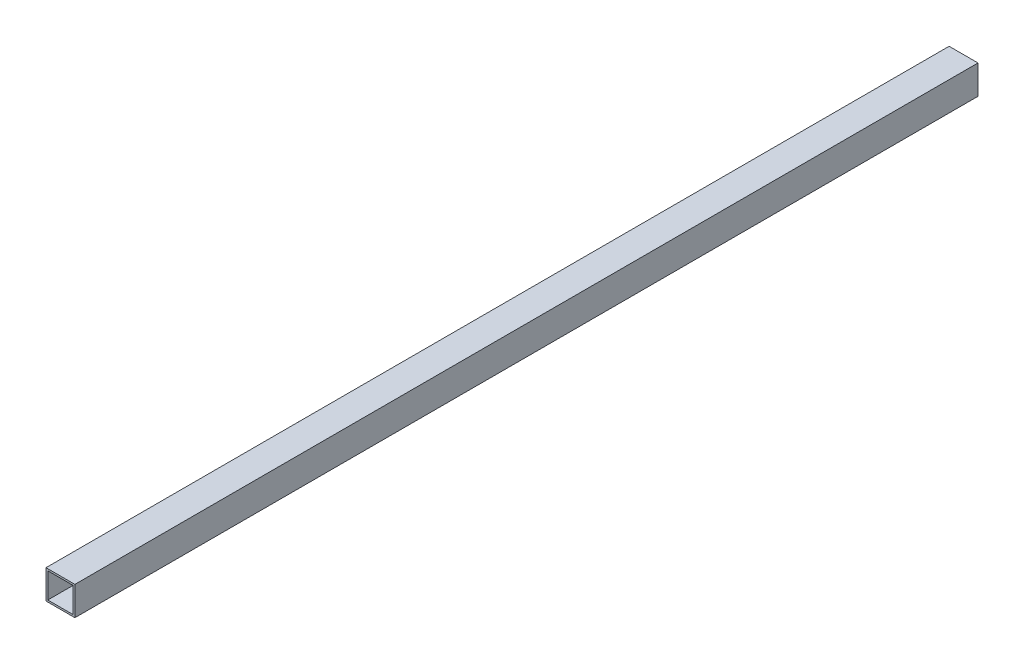
ISO-10303-21;
HEADER;
FILE_DESCRIPTION(('STEP AP214'),'2;1');
FILE_NAME('part.step','',(''),(''),'','','');
FILE_SCHEMA(('AUTOMOTIVE_DESIGN { 1 0 10303 214 1 1 1 1 }'));
ENDSEC;
DATA;
#1=APPLICATION_CONTEXT('core data for automotive mechanical design processes');
#2=APPLICATION_PROTOCOL_DEFINITION('international standard','automotive_design',2000,#1);
#3=PRODUCT_CONTEXT('',#1,'mechanical');
#4=PRODUCT('Part','Part','',(#3));
#5=PRODUCT_RELATED_PRODUCT_CATEGORY('part','',(#4));
#6=PRODUCT_DEFINITION_FORMATION('','',#4);
#7=PRODUCT_DEFINITION_CONTEXT('part definition',#1,'design');
#8=PRODUCT_DEFINITION('design','',#6,#7);
#9=PRODUCT_DEFINITION_SHAPE('','',#8);
#10=(LENGTH_UNIT() NAMED_UNIT(*) SI_UNIT(.MILLI.,.METRE.));
#11=(NAMED_UNIT(*) PLANE_ANGLE_UNIT() SI_UNIT($,.RADIAN.));
#12=(NAMED_UNIT(*) SI_UNIT($,.STERADIAN.) SOLID_ANGLE_UNIT());
#13=UNCERTAINTY_MEASURE_WITH_UNIT(LENGTH_MEASURE(1.E-05),#10,'distance_accuracy_value','');
#14=(GEOMETRIC_REPRESENTATION_CONTEXT(3) GLOBAL_UNCERTAINTY_ASSIGNED_CONTEXT((#13)) GLOBAL_UNIT_ASSIGNED_CONTEXT((#10,
#11,#12)) REPRESENTATION_CONTEXT('',''));
#15=CARTESIAN_POINT('',(0.,0.,0.));
#16=DIRECTION('',(0.,0.,1.));
#17=DIRECTION('',(1.,0.,0.));
#18=AXIS2_PLACEMENT_3D('',#15,#16,#17);
#19=CARTESIAN_POINT('',(0.,0.,250.));
#20=DIRECTION('',(0.,0.,-1.));
#21=DIRECTION('',(-1.,0.,0.));
#22=AXIS2_PLACEMENT_3D('',#19,#20,#21);
#23=PLANE('',#22);
#24=DIRECTION('',(0.,-1.,0.));
#25=VECTOR('',#24,1.);
#26=CARTESIAN_POINT('',(0.,0.,250.));
#27=LINE('',#26,#25);
#28=CARTESIAN_POINT('',(0.,8.,250.));
#29=VERTEX_POINT('',#28);
#30=CARTESIAN_POINT('',(0.,0.,250.));
#31=VERTEX_POINT('',#30);
#32=EDGE_CURVE('E153',#29,#31,#27,.T.);
#33=ORIENTED_EDGE('',*,*,#32,.T.);
#34=DIRECTION('',(1.,0.,0.));
#35=VECTOR('',#34,1.);
#36=CARTESIAN_POINT('',(0.,0.,250.));
#37=LINE('',#36,#35);
#38=CARTESIAN_POINT('',(8.,0.,250.));
#39=VERTEX_POINT('',#38);
#40=EDGE_CURVE('E157',#31,#39,#37,.T.);
#41=ORIENTED_EDGE('',*,*,#40,.T.);
#42=DIRECTION('',(0.,1.,0.));
#43=VECTOR('',#42,1.);
#44=CARTESIAN_POINT('',(8.,0.,250.));
#45=LINE('',#44,#43);
#46=CARTESIAN_POINT('',(8.,8.,250.));
#47=VERTEX_POINT('',#46);
#48=EDGE_CURVE('E161',#39,#47,#45,.T.);
#49=ORIENTED_EDGE('',*,*,#48,.T.);
#50=DIRECTION('',(-1.,0.,0.));
#51=VECTOR('',#50,1.);
#52=CARTESIAN_POINT('',(0.,8.,250.));
#53=LINE('',#52,#51);
#54=EDGE_CURVE('E164',#47,#29,#53,.T.);
#55=ORIENTED_EDGE('',*,*,#54,.T.);
#56=EDGE_LOOP('',(#33,#41,#49,#55));
#57=FACE_BOUND('',#56,.T.);
#58=DIRECTION('',(0.,-1.,0.));
#59=VECTOR('',#58,1.);
#60=CARTESIAN_POINT('',(0.499999999999998,7.5,250.));
#61=LINE('',#60,#59);
#62=CARTESIAN_POINT('',(0.499999999999998,7.5,250.));
#63=VERTEX_POINT('',#62);
#64=CARTESIAN_POINT('',(0.499999999999999,0.5,250.));
#65=VERTEX_POINT('',#64);
#66=EDGE_CURVE('E105',#63,#65,#61,.T.);
#67=ORIENTED_EDGE('',*,*,#66,.F.);
#68=DIRECTION('',(-1.,0.,0.));
#69=VECTOR('',#68,1.);
#70=CARTESIAN_POINT('',(0.499999999999998,7.5,250.));
#71=LINE('',#70,#69);
#72=CARTESIAN_POINT('',(7.5,7.5,250.));
#73=VERTEX_POINT('',#72);
#74=EDGE_CURVE('E131',#73,#63,#71,.T.);
#75=ORIENTED_EDGE('',*,*,#74,.F.);
#76=DIRECTION('',(0.,1.,0.));
#77=VECTOR('',#76,1.);
#78=CARTESIAN_POINT('',(7.5,7.5,250.));
#79=LINE('',#78,#77);
#80=CARTESIAN_POINT('',(7.5,0.5,250.));
#81=VERTEX_POINT('',#80);
#82=EDGE_CURVE('E127',#81,#73,#79,.T.);
#83=ORIENTED_EDGE('',*,*,#82,.F.);
#84=DIRECTION('',(1.,0.,0.));
#85=VECTOR('',#84,1.);
#86=CARTESIAN_POINT('',(0.499999999999999,0.5,250.));
#87=LINE('',#86,#85);
#88=EDGE_CURVE('E114',#65,#81,#87,.T.);
#89=ORIENTED_EDGE('',*,*,#88,.F.);
#90=EDGE_LOOP('',(#67,#75,#83,#89));
#91=FACE_BOUND('',#90,.T.);
#92=ADVANCED_FACE('F39',(#57,#91),#23,.F.);
#93=CARTESIAN_POINT('',(0.,0.,0.));
#94=DIRECTION('',(0.,0.,-1.));
#95=DIRECTION('',(-1.,0.,0.));
#96=AXIS2_PLACEMENT_3D('',#93,#94,#95);
#97=PLANE('',#96);
#98=DIRECTION('',(0.,-1.,0.));
#99=VECTOR('',#98,1.);
#100=CARTESIAN_POINT('',(0.,0.,0.));
#101=LINE('',#100,#99);
#102=CARTESIAN_POINT('',(0.,8.,0.));
#103=VERTEX_POINT('',#102);
#104=CARTESIAN_POINT('',(0.,0.,0.));
#105=VERTEX_POINT('',#104);
#106=EDGE_CURVE('E123',#103,#105,#101,.T.);
#107=ORIENTED_EDGE('',*,*,#106,.F.);
#108=DIRECTION('',(-1.,0.,0.));
#109=VECTOR('',#108,1.);
#110=CARTESIAN_POINT('',(0.,8.,0.));
#111=LINE('',#110,#109);
#112=CARTESIAN_POINT('',(8.,8.,0.));
#113=VERTEX_POINT('',#112);
#114=EDGE_CURVE('E158',#113,#103,#111,.T.);
#115=ORIENTED_EDGE('',*,*,#114,.F.);
#116=DIRECTION('',(0.,1.,0.));
#117=VECTOR('',#116,1.);
#118=CARTESIAN_POINT('',(8.,0.,0.));
#119=LINE('',#118,#117);
#120=CARTESIAN_POINT('',(8.,0.,0.));
#121=VERTEX_POINT('',#120);
#122=EDGE_CURVE('E174',#121,#113,#119,.T.);
#123=ORIENTED_EDGE('',*,*,#122,.F.);
#124=DIRECTION('',(1.,0.,0.));
#125=VECTOR('',#124,1.);
#126=CARTESIAN_POINT('',(0.,0.,0.));
#127=LINE('',#126,#125);
#128=EDGE_CURVE('E171',#105,#121,#127,.T.);
#129=ORIENTED_EDGE('',*,*,#128,.F.);
#130=EDGE_LOOP('',(#107,#115,#123,#129));
#131=FACE_BOUND('',#130,.T.);
#132=DIRECTION('',(-1.,0.,0.));
#133=VECTOR('',#132,1.);
#134=CARTESIAN_POINT('',(0.499999999999998,7.5,0.));
#135=LINE('',#134,#133);
#136=CARTESIAN_POINT('',(7.5,7.5,0.));
#137=VERTEX_POINT('',#136);
#138=CARTESIAN_POINT('',(0.499999999999998,7.5,0.));
#139=VERTEX_POINT('',#138);
#140=EDGE_CURVE('E115',#137,#139,#135,.T.);
#141=ORIENTED_EDGE('',*,*,#140,.T.);
#142=DIRECTION('',(0.,-1.,0.));
#143=VECTOR('',#142,1.);
#144=CARTESIAN_POINT('',(0.499999999999998,7.5,0.));
#145=LINE('',#144,#143);
#146=CARTESIAN_POINT('',(0.499999999999999,0.5,0.));
#147=VERTEX_POINT('',#146);
#148=EDGE_CURVE('E63',#139,#147,#145,.T.);
#149=ORIENTED_EDGE('',*,*,#148,.T.);
#150=DIRECTION('',(1.,0.,0.));
#151=VECTOR('',#150,1.);
#152=CARTESIAN_POINT('',(0.499999999999999,0.5,0.));
#153=LINE('',#152,#151);
#154=CARTESIAN_POINT('',(7.5,0.5,0.));
#155=VERTEX_POINT('',#154);
#156=EDGE_CURVE('E121',#147,#155,#153,.T.);
#157=ORIENTED_EDGE('',*,*,#156,.T.);
#158=DIRECTION('',(0.,1.,0.));
#159=VECTOR('',#158,1.);
#160=CARTESIAN_POINT('',(7.5,7.5,0.));
#161=LINE('',#160,#159);
#162=EDGE_CURVE('E140',#155,#137,#161,.T.);
#163=ORIENTED_EDGE('',*,*,#162,.T.);
#164=EDGE_LOOP('',(#141,#149,#157,#163));
#165=FACE_BOUND('',#164,.T.);
#166=ADVANCED_FACE('F197',(#131,#165),#97,.T.);
#167=CARTESIAN_POINT('',(0.,0.,250.));
#168=DIRECTION('',(1.,0.,0.));
#169=DIRECTION('',(0.,0.,-1.));
#170=AXIS2_PLACEMENT_3D('',#167,#168,#169);
#171=PLANE('',#170);
#172=ORIENTED_EDGE('',*,*,#106,.T.);
#173=DIRECTION('',(0.,0.,-1.));
#174=VECTOR('',#173,1.);
#175=CARTESIAN_POINT('',(0.,0.,250.));
#176=LINE('',#175,#174);
#177=EDGE_CURVE('E11',#31,#105,#176,.T.);
#178=ORIENTED_EDGE('',*,*,#177,.F.);
#179=ORIENTED_EDGE('',*,*,#32,.F.);
#180=DIRECTION('',(0.,0.,-1.));
#181=VECTOR('',#180,1.);
#182=CARTESIAN_POINT('',(0.,8.,250.));
#183=LINE('',#182,#181);
#184=EDGE_CURVE('E167',#29,#103,#183,.T.);
#185=ORIENTED_EDGE('',*,*,#184,.T.);
#186=EDGE_LOOP('',(#172,#178,#179,#185));
#187=FACE_BOUND('',#186,.T.);
#188=ADVANCED_FACE('F41',(#187),#171,.F.);
#189=CARTESIAN_POINT('',(0.,0.,250.));
#190=DIRECTION('',(0.,1.,0.));
#191=DIRECTION('',(0.,0.,1.));
#192=AXIS2_PLACEMENT_3D('',#189,#190,#191);
#193=PLANE('',#192);
#194=ORIENTED_EDGE('',*,*,#128,.T.);
#195=DIRECTION('',(0.,0.,-1.));
#196=VECTOR('',#195,1.);
#197=CARTESIAN_POINT('',(8.,0.,250.));
#198=LINE('',#197,#196);
#199=EDGE_CURVE('E48',#39,#121,#198,.T.);
#200=ORIENTED_EDGE('',*,*,#199,.F.);
#201=ORIENTED_EDGE('',*,*,#40,.F.);
#202=ORIENTED_EDGE('',*,*,#177,.T.);
#203=EDGE_LOOP('',(#194,#200,#201,#202));
#204=FACE_BOUND('',#203,.T.);
#205=ADVANCED_FACE('F207',(#204),#193,.F.);
#206=CARTESIAN_POINT('',(8.,0.,250.));
#207=DIRECTION('',(-1.,0.,0.));
#208=DIRECTION('',(0.,0.,1.));
#209=AXIS2_PLACEMENT_3D('',#206,#207,#208);
#210=PLANE('',#209);
#211=ORIENTED_EDGE('',*,*,#122,.T.);
#212=DIRECTION('',(0.,0.,-1.));
#213=VECTOR('',#212,1.);
#214=CARTESIAN_POINT('',(8.,8.,250.));
#215=LINE('',#214,#213);
#216=EDGE_CURVE('E182',#47,#113,#215,.T.);
#217=ORIENTED_EDGE('',*,*,#216,.F.);
#218=ORIENTED_EDGE('',*,*,#48,.F.);
#219=ORIENTED_EDGE('',*,*,#199,.T.);
#220=EDGE_LOOP('',(#211,#217,#218,#219));
#221=FACE_BOUND('',#220,.T.);
#222=ADVANCED_FACE('F191',(#221),#210,.F.);
#223=CARTESIAN_POINT('',(0.,8.,250.));
#224=DIRECTION('',(0.,-1.,0.));
#225=DIRECTION('',(0.,0.,-1.));
#226=AXIS2_PLACEMENT_3D('',#223,#224,#225);
#227=PLANE('',#226);
#228=ORIENTED_EDGE('',*,*,#114,.T.);
#229=ORIENTED_EDGE('',*,*,#184,.F.);
#230=ORIENTED_EDGE('',*,*,#54,.F.);
#231=ORIENTED_EDGE('',*,*,#216,.T.);
#232=EDGE_LOOP('',(#228,#229,#230,#231));
#233=FACE_BOUND('',#232,.T.);
#234=ADVANCED_FACE('F201',(#233),#227,.F.);
#235=CARTESIAN_POINT('',(0.499999999999998,7.5,250.));
#236=DIRECTION('',(1.,0.,0.));
#237=DIRECTION('',(0.,1.,0.));
#238=AXIS2_PLACEMENT_3D('',#235,#236,#237);
#239=PLANE('',#238);
#240=ORIENTED_EDGE('',*,*,#148,.F.);
#241=DIRECTION('',(0.,0.,-1.));
#242=VECTOR('',#241,1.);
#243=CARTESIAN_POINT('',(0.499999999999998,7.5,250.));
#244=LINE('',#243,#242);
#245=EDGE_CURVE('E109',#63,#139,#244,.T.);
#246=ORIENTED_EDGE('',*,*,#245,.F.);
#247=ORIENTED_EDGE('',*,*,#66,.T.);
#248=DIRECTION('',(0.,0.,-1.));
#249=VECTOR('',#248,1.);
#250=CARTESIAN_POINT('',(0.499999999999999,0.5,250.));
#251=LINE('',#250,#249);
#252=EDGE_CURVE('E108',#65,#147,#251,.T.);
#253=ORIENTED_EDGE('',*,*,#252,.T.);
#254=EDGE_LOOP('',(#240,#246,#247,#253));
#255=FACE_BOUND('',#254,.T.);
#256=ADVANCED_FACE('F107',(#255),#239,.T.);
#257=CARTESIAN_POINT('',(0.499999999999999,0.5,250.));
#258=DIRECTION('',(0.,1.,0.));
#259=DIRECTION('',(0.,0.,1.));
#260=AXIS2_PLACEMENT_3D('',#257,#258,#259);
#261=PLANE('',#260);
#262=ORIENTED_EDGE('',*,*,#156,.F.);
#263=ORIENTED_EDGE('',*,*,#252,.F.);
#264=ORIENTED_EDGE('',*,*,#88,.T.);
#265=DIRECTION('',(0.,0.,-1.));
#266=VECTOR('',#265,1.);
#267=CARTESIAN_POINT('',(7.5,0.5,250.));
#268=LINE('',#267,#266);
#269=EDGE_CURVE('E124',#81,#155,#268,.T.);
#270=ORIENTED_EDGE('',*,*,#269,.T.);
#271=EDGE_LOOP('',(#262,#263,#264,#270));
#272=FACE_BOUND('',#271,.T.);
#273=ADVANCED_FACE('F118',(#272),#261,.T.);
#274=CARTESIAN_POINT('',(7.5,7.5,250.));
#275=DIRECTION('',(-1.,0.,0.));
#276=DIRECTION('',(0.,-1.,0.));
#277=AXIS2_PLACEMENT_3D('',#274,#275,#276);
#278=PLANE('',#277);
#279=ORIENTED_EDGE('',*,*,#162,.F.);
#280=ORIENTED_EDGE('',*,*,#269,.F.);
#281=ORIENTED_EDGE('',*,*,#82,.T.);
#282=DIRECTION('',(0.,0.,-1.));
#283=VECTOR('',#282,1.);
#284=CARTESIAN_POINT('',(7.5,7.5,250.));
#285=LINE('',#284,#283);
#286=EDGE_CURVE('E55',#73,#137,#285,.T.);
#287=ORIENTED_EDGE('',*,*,#286,.T.);
#288=EDGE_LOOP('',(#279,#280,#281,#287));
#289=FACE_BOUND('',#288,.T.);
#290=ADVANCED_FACE('F230',(#289),#278,.T.);
#291=CARTESIAN_POINT('',(0.499999999999998,7.5,250.));
#292=DIRECTION('',(0.,-1.,0.));
#293=DIRECTION('',(0.,0.,-1.));
#294=AXIS2_PLACEMENT_3D('',#291,#292,#293);
#295=PLANE('',#294);
#296=ORIENTED_EDGE('',*,*,#140,.F.);
#297=ORIENTED_EDGE('',*,*,#286,.F.);
#298=ORIENTED_EDGE('',*,*,#74,.T.);
#299=ORIENTED_EDGE('',*,*,#245,.T.);
#300=EDGE_LOOP('',(#296,#297,#298,#299));
#301=FACE_BOUND('',#300,.T.);
#302=ADVANCED_FACE('F234',(#301),#295,.T.);
#303=CLOSED_SHELL('',(#92,#166,#188,#205,#222,#234,#256,#273,#290,#302));
#304=MANIFOLD_SOLID_BREP('B2',#303);
#305=ADVANCED_BREP_SHAPE_REPRESENTATION('',(#18,#304),#14);
#306=SHAPE_DEFINITION_REPRESENTATION(#9,#305);
ENDSEC;
END-ISO-10303-21;
